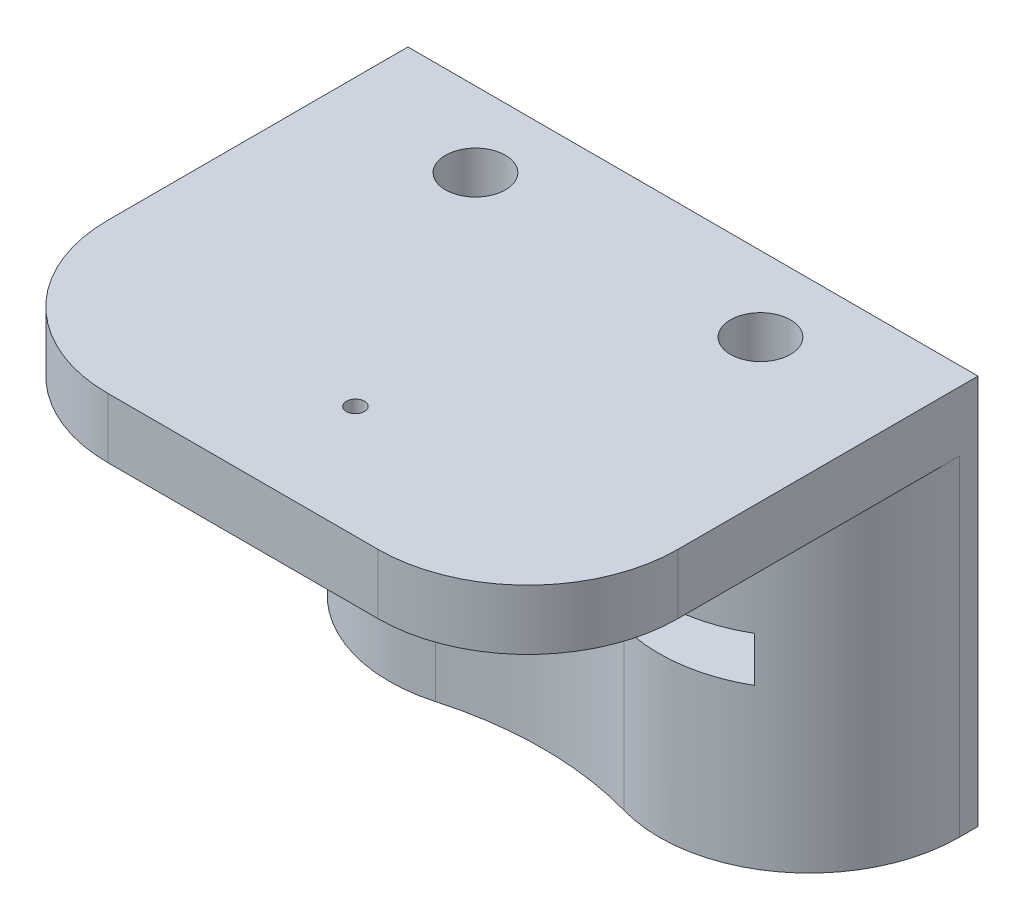
ISO-10303-21;
HEADER;
FILE_DESCRIPTION(('STEP AP214'),'2;1');
FILE_NAME('part.step','',(''),(''),'','','');
FILE_SCHEMA(('AUTOMOTIVE_DESIGN { 1 0 10303 214 1 1 1 1 }'));
ENDSEC;
DATA;
#1=APPLICATION_CONTEXT('core data for automotive mechanical design processes');
#2=APPLICATION_PROTOCOL_DEFINITION('international standard','automotive_design',2000,#1);
#3=PRODUCT_CONTEXT('',#1,'mechanical');
#4=PRODUCT('Part','Part','',(#3));
#5=PRODUCT_RELATED_PRODUCT_CATEGORY('part','',(#4));
#6=PRODUCT_DEFINITION_FORMATION('','',#4);
#7=PRODUCT_DEFINITION_CONTEXT('part definition',#1,'design');
#8=PRODUCT_DEFINITION('design','',#6,#7);
#9=PRODUCT_DEFINITION_SHAPE('','',#8);
#10=(LENGTH_UNIT() NAMED_UNIT(*) SI_UNIT(.MILLI.,.METRE.));
#11=(NAMED_UNIT(*) PLANE_ANGLE_UNIT() SI_UNIT($,.RADIAN.));
#12=(NAMED_UNIT(*) SI_UNIT($,.STERADIAN.) SOLID_ANGLE_UNIT());
#13=UNCERTAINTY_MEASURE_WITH_UNIT(LENGTH_MEASURE(1.E-05),#10,'distance_accuracy_value','');
#14=(GEOMETRIC_REPRESENTATION_CONTEXT(3) GLOBAL_UNCERTAINTY_ASSIGNED_CONTEXT((#13)) GLOBAL_UNIT_ASSIGNED_CONTEXT((#10,
#11,#12)) REPRESENTATION_CONTEXT('',''));
#15=CARTESIAN_POINT('',(0.,0.,0.));
#16=DIRECTION('',(0.,0.,1.));
#17=DIRECTION('',(1.,0.,0.));
#18=AXIS2_PLACEMENT_3D('',#15,#16,#17);
#19=CARTESIAN_POINT('',(-33.1070823408573,4.,37.625158927755));
#20=DIRECTION('',(0.,-1.,0.));
#21=DIRECTION('',(0.,0.,-1.));
#22=AXIS2_PLACEMENT_3D('',#19,#20,#21);
#23=PLANE('',#22);
#24=CARTESIAN_POINT('',(-14.6070823408573,4.,22.625158927755));
#25=DIRECTION('',(0.,1.,0.));
#26=DIRECTION('',(0.,0.,-1.));
#27=AXIS2_PLACEMENT_3D('',#24,#25,#26);
#28=CIRCLE('',#27,2.);
#29=CARTESIAN_POINT('',(-14.6070823408573,4.,24.625158927755));
#30=VERTEX_POINT('',#29);
#31=EDGE_CURVE('E239',#30,#30,#28,.T.);
#32=ORIENTED_EDGE('',*,*,#31,.F.);
#33=EDGE_LOOP('',(#32));
#34=FACE_BOUND('',#33,.T.);
#35=CARTESIAN_POINT('',(-33.6070823408573,4.,22.625158927755));
#36=DIRECTION('',(0.,1.,0.));
#37=DIRECTION('',(0.,0.,1.));
#38=AXIS2_PLACEMENT_3D('',#35,#36,#37);
#39=CIRCLE('',#38,2.);
#40=CARTESIAN_POINT('',(-33.6070823408573,4.,24.625158927755));
#41=VERTEX_POINT('',#40);
#42=EDGE_CURVE('E242',#41,#41,#39,.T.);
#43=ORIENTED_EDGE('',*,*,#42,.F.);
#44=EDGE_LOOP('',(#43));
#45=FACE_BOUND('',#44,.T.);
#46=DIRECTION('',(0.,0.,1.));
#47=VECTOR('',#46,1.);
#48=CARTESIAN_POINT('',(-43.1070823408573,4.,17.625158927755));
#49=LINE('',#48,#47);
#50=CARTESIAN_POINT('',(-43.1070823408573,4.,17.625158927755));
#51=VERTEX_POINT('',#50);
#52=CARTESIAN_POINT('',(-43.1070823408573,4.,37.625158927755));
#53=VERTEX_POINT('',#52);
#54=EDGE_CURVE('E265',#51,#53,#49,.T.);
#55=ORIENTED_EDGE('',*,*,#54,.T.);
#56=CARTESIAN_POINT('',(-33.1070823408573,4.,37.625158927755));
#57=DIRECTION('',(0.,1.,0.));
#58=DIRECTION('',(0.,0.,-1.));
#59=AXIS2_PLACEMENT_3D('',#56,#57,#58);
#60=CIRCLE('',#59,10.);
#61=CARTESIAN_POINT('',(-33.1070823408572,4.,47.625158927755));
#62=VERTEX_POINT('',#61);
#63=EDGE_CURVE('E268',#53,#62,#60,.T.);
#64=ORIENTED_EDGE('',*,*,#63,.T.);
#65=DIRECTION('',(1.,0.,0.));
#66=VECTOR('',#65,1.);
#67=CARTESIAN_POINT('',(-33.1070823408572,4.,47.625158927755));
#68=LINE('',#67,#66);
#69=CARTESIAN_POINT('',(-15.1070823408574,4.,47.625158927755));
#70=VERTEX_POINT('',#69);
#71=EDGE_CURVE('E271',#62,#70,#68,.T.);
#72=ORIENTED_EDGE('',*,*,#71,.T.);
#73=CARTESIAN_POINT('',(-15.1070823408573,4.,37.625158927755));
#74=DIRECTION('',(0.,1.,0.));
#75=DIRECTION('',(0.,0.,1.));
#76=AXIS2_PLACEMENT_3D('',#73,#74,#75);
#77=CIRCLE('',#76,10.);
#78=CARTESIAN_POINT('',(-5.10708234085731,4.,37.625158927755));
#79=VERTEX_POINT('',#78);
#80=EDGE_CURVE('E273',#70,#79,#77,.T.);
#81=ORIENTED_EDGE('',*,*,#80,.T.);
#82=DIRECTION('',(0.,0.,-1.));
#83=VECTOR('',#82,1.);
#84=CARTESIAN_POINT('',(-5.10708234085731,4.,17.625158927755));
#85=LINE('',#84,#83);
#86=CARTESIAN_POINT('',(-5.10708234085731,4.,17.625158927755));
#87=VERTEX_POINT('',#86);
#88=EDGE_CURVE('E275',#79,#87,#85,.T.);
#89=ORIENTED_EDGE('',*,*,#88,.T.);
#90=DIRECTION('',(-1.,0.,0.));
#91=VECTOR('',#90,1.);
#92=CARTESIAN_POINT('',(-43.1070823408573,4.,17.625158927755));
#93=LINE('',#92,#91);
#94=EDGE_CURVE('E277',#87,#51,#93,.T.);
#95=ORIENTED_EDGE('',*,*,#94,.T.);
#96=EDGE_LOOP('',(#55,#64,#72,#81,#89,#95));
#97=FACE_BOUND('',#96,.T.);
#98=CARTESIAN_POINT('',(-24.1070823408573,4.,40.125158927755));
#99=DIRECTION('',(0.,1.,0.));
#100=DIRECTION('',(0.,0.,1.));
#101=AXIS2_PLACEMENT_3D('',#98,#99,#100);
#102=CIRCLE('',#101,0.600000000000001);
#103=CARTESIAN_POINT('',(-24.1070823408573,4.,40.725158927755));
#104=VERTEX_POINT('',#103);
#105=EDGE_CURVE('E259',#104,#104,#102,.T.);
#106=ORIENTED_EDGE('',*,*,#105,.F.);
#107=EDGE_LOOP('',(#106));
#108=FACE_BOUND('',#107,.T.);
#109=ADVANCED_FACE('F33',(#34,#45,#97,#108),#23,.F.);
#110=CARTESIAN_POINT('',(-33.1070823408573,0.,37.625158927755));
#111=DIRECTION('',(0.,-1.,0.));
#112=DIRECTION('',(0.,0.,-1.));
#113=AXIS2_PLACEMENT_3D('',#110,#111,#112);
#114=PLANE('',#113);
#115=CARTESIAN_POINT('',(-24.1070823408573,0.,50.675158927755));
#116=DIRECTION('',(0.,1.,0.));
#117=DIRECTION('',(0.,0.,-1.));
#118=AXIS2_PLACEMENT_3D('',#115,#116,#117);
#119=CIRCLE('',#118,23.05);
#120=CARTESIAN_POINT('',(-17.8302290882098,0.,28.4962587466205));
#121=VERTEX_POINT('',#120);
#122=CARTESIAN_POINT('',(-30.3839355935048,0.,28.4962587466205));
#123=VERTEX_POINT('',#122);
#124=EDGE_CURVE('E245',#121,#123,#119,.T.);
#125=ORIENTED_EDGE('',*,*,#124,.F.);
#126=CARTESIAN_POINT('',(-15.1070823408573,0.,18.8741762385361));
#127=DIRECTION('',(0.,-1.,0.));
#128=DIRECTION('',(0.,0.,-1.));
#129=AXIS2_PLACEMENT_3D('',#126,#127,#128);
#130=CIRCLE('',#129,10.);
#131=CARTESIAN_POINT('',(-5.10708234085731,0.,18.8741762385361));
#132=VERTEX_POINT('',#131);
#133=EDGE_CURVE('E326',#121,#132,#130,.F.);
#134=ORIENTED_EDGE('',*,*,#133,.T.);
#135=DIRECTION('',(0.,0.,-1.));
#136=VECTOR('',#135,1.);
#137=CARTESIAN_POINT('',(-5.10708234085731,0.,37.625158927755));
#138=LINE('',#137,#136);
#139=CARTESIAN_POINT('',(-5.10708234085731,0.,37.625158927755));
#140=VERTEX_POINT('',#139);
#141=EDGE_CURVE('E321',#140,#132,#138,.T.);
#142=ORIENTED_EDGE('',*,*,#141,.F.);
#143=CARTESIAN_POINT('',(-15.1070823408573,0.,37.625158927755));
#144=DIRECTION('',(0.,1.,0.));
#145=DIRECTION('',(0.,0.,1.));
#146=AXIS2_PLACEMENT_3D('',#143,#144,#145);
#147=CIRCLE('',#146,10.);
#148=CARTESIAN_POINT('',(-15.1070823408574,0.,47.625158927755));
#149=VERTEX_POINT('',#148);
#150=EDGE_CURVE('E269',#149,#140,#147,.T.);
#151=ORIENTED_EDGE('',*,*,#150,.F.);
#152=DIRECTION('',(1.,0.,0.));
#153=VECTOR('',#152,1.);
#154=CARTESIAN_POINT('',(-33.1070823408572,0.,47.625158927755));
#155=LINE('',#154,#153);
#156=CARTESIAN_POINT('',(-33.1070823408572,0.,47.625158927755));
#157=VERTEX_POINT('',#156);
#158=EDGE_CURVE('E281',#157,#149,#155,.T.);
#159=ORIENTED_EDGE('',*,*,#158,.F.);
#160=CARTESIAN_POINT('',(-33.1070823408573,0.,37.625158927755));
#161=DIRECTION('',(0.,1.,0.));
#162=DIRECTION('',(0.,0.,-1.));
#163=AXIS2_PLACEMENT_3D('',#160,#161,#162);
#164=CIRCLE('',#163,10.);
#165=CARTESIAN_POINT('',(-43.1070823408573,0.,37.625158927755));
#166=VERTEX_POINT('',#165);
#167=EDGE_CURVE('E262',#166,#157,#164,.T.);
#168=ORIENTED_EDGE('',*,*,#167,.F.);
#169=DIRECTION('',(0.,0.,1.));
#170=VECTOR('',#169,1.);
#171=CARTESIAN_POINT('',(-43.1070823408573,0.,37.625158927755));
#172=LINE('',#171,#170);
#173=CARTESIAN_POINT('',(-43.1070823408573,0.,18.8741762385361));
#174=VERTEX_POINT('',#173);
#175=EDGE_CURVE('E301',#174,#166,#172,.T.);
#176=ORIENTED_EDGE('',*,*,#175,.F.);
#177=CARTESIAN_POINT('',(-33.1070823408573,0.,18.8741762385361));
#178=DIRECTION('',(0.,-1.,0.));
#179=DIRECTION('',(0.,0.,-1.));
#180=AXIS2_PLACEMENT_3D('',#177,#178,#179);
#181=CIRCLE('',#180,10.);
#182=EDGE_CURVE('E312',#174,#123,#181,.F.);
#183=ORIENTED_EDGE('',*,*,#182,.T.);
#184=EDGE_LOOP('',(#125,#134,#142,#151,#159,#168,#176,#183));
#185=FACE_BOUND('',#184,.T.);
#186=CARTESIAN_POINT('',(-24.1070823408573,0.,40.125158927755));
#187=DIRECTION('',(0.,1.,0.));
#188=DIRECTION('',(0.,0.,1.));
#189=AXIS2_PLACEMENT_3D('',#186,#187,#188);
#190=CIRCLE('',#189,0.600000000000001);
#191=CARTESIAN_POINT('',(-24.1070823408573,0.,40.725158927755));
#192=VERTEX_POINT('',#191);
#193=EDGE_CURVE('E257',#192,#192,#190,.T.);
#194=ORIENTED_EDGE('',*,*,#193,.T.);
#195=EDGE_LOOP('',(#194));
#196=FACE_BOUND('',#195,.T.);
#197=ADVANCED_FACE('F365',(#185,#196),#114,.T.);
#198=CARTESIAN_POINT('',(-43.1070823408573,4.,17.625158927755));
#199=DIRECTION('',(1.,0.,0.));
#200=DIRECTION('',(0.,0.,-1.));
#201=AXIS2_PLACEMENT_3D('',#198,#199,#200);
#202=PLANE('',#201);
#203=DIRECTION('',(0.,0.,-1.));
#204=VECTOR('',#203,1.);
#205=CARTESIAN_POINT('',(-43.1070823408573,-22.,17.625158927755));
#206=LINE('',#205,#204);
#207=CARTESIAN_POINT('',(-43.1070823408573,-22.,18.8741762385361));
#208=VERTEX_POINT('',#207);
#209=CARTESIAN_POINT('',(-43.1070823408573,-22.,17.625158927755));
#210=VERTEX_POINT('',#209);
#211=EDGE_CURVE('E246',#208,#210,#206,.T.);
#212=ORIENTED_EDGE('',*,*,#211,.F.);
#213=DIRECTION('',(0.,1.,0.));
#214=VECTOR('',#213,1.);
#215=CARTESIAN_POINT('',(-43.1070823408573,4.,18.8741762385361));
#216=LINE('',#215,#214);
#217=EDGE_CURVE('E303',#208,#174,#216,.T.);
#218=ORIENTED_EDGE('',*,*,#217,.T.);
#219=ORIENTED_EDGE('',*,*,#175,.T.);
#220=DIRECTION('',(0.,-1.,0.));
#221=VECTOR('',#220,1.);
#222=CARTESIAN_POINT('',(-43.1070823408573,4.,37.625158927755));
#223=LINE('',#222,#221);
#224=EDGE_CURVE('E298',#53,#166,#223,.T.);
#225=ORIENTED_EDGE('',*,*,#224,.F.);
#226=ORIENTED_EDGE('',*,*,#54,.F.);
#227=DIRECTION('',(0.,-1.,0.));
#228=VECTOR('',#227,1.);
#229=CARTESIAN_POINT('',(-43.1070823408573,4.,17.625158927755));
#230=LINE('',#229,#228);
#231=EDGE_CURVE('E279',#51,#210,#230,.T.);
#232=ORIENTED_EDGE('',*,*,#231,.T.);
#233=EDGE_LOOP('',(#212,#218,#219,#225,#226,#232));
#234=FACE_BOUND('',#233,.T.);
#235=ADVANCED_FACE('F396',(#234),#202,.F.);
#236=CARTESIAN_POINT('',(-33.1070823408573,4.,37.625158927755));
#237=DIRECTION('',(0.,-1.,0.));
#238=DIRECTION('',(0.,0.,-1.));
#239=AXIS2_PLACEMENT_3D('',#236,#237,#238);
#240=CYLINDRICAL_SURFACE('',#239,10.);
#241=ORIENTED_EDGE('',*,*,#167,.T.);
#242=DIRECTION('',(0.,-1.,0.));
#243=VECTOR('',#242,1.);
#244=CARTESIAN_POINT('',(-33.1070823408572,4.,47.625158927755));
#245=LINE('',#244,#243);
#246=EDGE_CURVE('E295',#62,#157,#245,.T.);
#247=ORIENTED_EDGE('',*,*,#246,.F.);
#248=ORIENTED_EDGE('',*,*,#63,.F.);
#249=ORIENTED_EDGE('',*,*,#224,.T.);
#250=EDGE_LOOP('',(#241,#247,#248,#249));
#251=FACE_BOUND('',#250,.T.);
#252=ADVANCED_FACE('F411',(#251),#240,.T.);
#253=CARTESIAN_POINT('',(-33.1070823408572,4.,47.625158927755));
#254=DIRECTION('',(0.,0.,-1.));
#255=DIRECTION('',(-1.,0.,0.));
#256=AXIS2_PLACEMENT_3D('',#253,#254,#255);
#257=PLANE('',#256);
#258=ORIENTED_EDGE('',*,*,#158,.T.);
#259=DIRECTION('',(0.,-1.,0.));
#260=VECTOR('',#259,1.);
#261=CARTESIAN_POINT('',(-15.1070823408574,4.,47.625158927755));
#262=LINE('',#261,#260);
#263=EDGE_CURVE('E292',#70,#149,#262,.T.);
#264=ORIENTED_EDGE('',*,*,#263,.F.);
#265=ORIENTED_EDGE('',*,*,#71,.F.);
#266=ORIENTED_EDGE('',*,*,#246,.T.);
#267=EDGE_LOOP('',(#258,#264,#265,#266));
#268=FACE_BOUND('',#267,.T.);
#269=ADVANCED_FACE('F408',(#268),#257,.F.);
#270=CARTESIAN_POINT('',(-15.1070823408573,4.,37.625158927755));
#271=DIRECTION('',(0.,-1.,0.));
#272=DIRECTION('',(0.,0.,-1.));
#273=AXIS2_PLACEMENT_3D('',#270,#271,#272);
#274=CYLINDRICAL_SURFACE('',#273,10.);
#275=ORIENTED_EDGE('',*,*,#150,.T.);
#276=DIRECTION('',(0.,-1.,0.));
#277=VECTOR('',#276,1.);
#278=CARTESIAN_POINT('',(-5.10708234085731,4.,37.625158927755));
#279=LINE('',#278,#277);
#280=EDGE_CURVE('E289',#79,#140,#279,.T.);
#281=ORIENTED_EDGE('',*,*,#280,.F.);
#282=ORIENTED_EDGE('',*,*,#80,.F.);
#283=ORIENTED_EDGE('',*,*,#263,.T.);
#284=EDGE_LOOP('',(#275,#281,#282,#283));
#285=FACE_BOUND('',#284,.T.);
#286=ADVANCED_FACE('F406',(#285),#274,.T.);
#287=CARTESIAN_POINT('',(-5.10708234085731,4.,17.625158927755));
#288=DIRECTION('',(-1.,0.,0.));
#289=DIRECTION('',(0.,0.,1.));
#290=AXIS2_PLACEMENT_3D('',#287,#288,#289);
#291=PLANE('',#290);
#292=ORIENTED_EDGE('',*,*,#280,.T.);
#293=ORIENTED_EDGE('',*,*,#141,.T.);
#294=DIRECTION('',(0.,1.,0.));
#295=VECTOR('',#294,1.);
#296=CARTESIAN_POINT('',(-5.10708234085731,4.,18.8741762385361));
#297=LINE('',#296,#295);
#298=CARTESIAN_POINT('',(-5.10708234085731,-22.,18.8741762385361));
#299=VERTEX_POINT('',#298);
#300=EDGE_CURVE('E319',#132,#299,#297,.F.);
#301=ORIENTED_EDGE('',*,*,#300,.T.);
#302=DIRECTION('',(0.,0.,1.));
#303=VECTOR('',#302,1.);
#304=CARTESIAN_POINT('',(-5.10708234085731,-22.,17.625158927755));
#305=LINE('',#304,#303);
#306=CARTESIAN_POINT('',(-5.10708234085731,-22.,17.625158927755));
#307=VERTEX_POINT('',#306);
#308=EDGE_CURVE('E251',#307,#299,#305,.T.);
#309=ORIENTED_EDGE('',*,*,#308,.F.);
#310=DIRECTION('',(0.,-1.,0.));
#311=VECTOR('',#310,1.);
#312=CARTESIAN_POINT('',(-5.10708234085731,4.,17.625158927755));
#313=LINE('',#312,#311);
#314=EDGE_CURVE('E287',#87,#307,#313,.T.);
#315=ORIENTED_EDGE('',*,*,#314,.F.);
#316=ORIENTED_EDGE('',*,*,#88,.F.);
#317=EDGE_LOOP('',(#292,#293,#301,#309,#315,#316));
#318=FACE_BOUND('',#317,.T.);
#319=ADVANCED_FACE('F359',(#318),#291,.F.);
#320=CARTESIAN_POINT('',(-43.1070823408573,4.,17.625158927755));
#321=DIRECTION('',(0.,0.,1.));
#322=DIRECTION('',(1.,0.,0.));
#323=AXIS2_PLACEMENT_3D('',#320,#321,#322);
#324=PLANE('',#323);
#325=DIRECTION('',(0.,-1.,0.));
#326=VECTOR('',#325,1.);
#327=CARTESIAN_POINT('',(-10.1070823408573,-8.4,17.625158927755));
#328=LINE('',#327,#326);
#329=CARTESIAN_POINT('',(-10.1070823408573,-8.4,17.625158927755));
#330=VERTEX_POINT('',#329);
#331=CARTESIAN_POINT('',(-10.1070823408573,-11.4,17.625158927755));
#332=VERTEX_POINT('',#331);
#333=EDGE_CURVE('E182',#330,#332,#328,.T.);
#334=ORIENTED_EDGE('',*,*,#333,.F.);
#335=DIRECTION('',(1.,0.,0.));
#336=VECTOR('',#335,1.);
#337=CARTESIAN_POINT('',(-19.1070823408573,-8.4,17.625158927755));
#338=LINE('',#337,#336);
#339=CARTESIAN_POINT('',(-19.1070823408573,-8.4,17.625158927755));
#340=VERTEX_POINT('',#339);
#341=EDGE_CURVE('E48',#340,#330,#338,.T.);
#342=ORIENTED_EDGE('',*,*,#341,.F.);
#343=DIRECTION('',(0.,1.,0.));
#344=VECTOR('',#343,1.);
#345=CARTESIAN_POINT('',(-19.1070823408573,-8.4,17.625158927755));
#346=LINE('',#345,#344);
#347=CARTESIAN_POINT('',(-19.1070823408573,-11.4,17.625158927755));
#348=VERTEX_POINT('',#347);
#349=EDGE_CURVE('E189',#348,#340,#346,.T.);
#350=ORIENTED_EDGE('',*,*,#349,.F.);
#351=DIRECTION('',(-1.,0.,0.));
#352=VECTOR('',#351,1.);
#353=CARTESIAN_POINT('',(-10.1070823408573,-11.4,17.625158927755));
#354=LINE('',#353,#352);
#355=EDGE_CURVE('E173',#332,#348,#354,.T.);
#356=ORIENTED_EDGE('',*,*,#355,.F.);
#357=EDGE_LOOP('',(#334,#342,#350,#356));
#358=FACE_BOUND('',#357,.T.);
#359=DIRECTION('',(-1.,0.,0.));
#360=VECTOR('',#359,1.);
#361=CARTESIAN_POINT('',(-38.1070823408573,-11.4,17.625158927755));
#362=LINE('',#361,#360);
#363=CARTESIAN_POINT('',(-29.1070823408573,-11.4,17.625158927755));
#364=VERTEX_POINT('',#363);
#365=CARTESIAN_POINT('',(-38.1070823408573,-11.4,17.625158927755));
#366=VERTEX_POINT('',#365);
#367=EDGE_CURVE('E210',#364,#366,#362,.T.);
#368=ORIENTED_EDGE('',*,*,#367,.F.);
#369=DIRECTION('',(0.,-1.,0.));
#370=VECTOR('',#369,1.);
#371=CARTESIAN_POINT('',(-29.1070823408573,-8.4,17.625158927755));
#372=LINE('',#371,#370);
#373=CARTESIAN_POINT('',(-29.1070823408573,-8.4,17.625158927755));
#374=VERTEX_POINT('',#373);
#375=EDGE_CURVE('E208',#374,#364,#372,.T.);
#376=ORIENTED_EDGE('',*,*,#375,.F.);
#377=DIRECTION('',(1.,0.,0.));
#378=VECTOR('',#377,1.);
#379=CARTESIAN_POINT('',(-29.1070823408573,-8.4,17.625158927755));
#380=LINE('',#379,#378);
#381=CARTESIAN_POINT('',(-38.1070823408573,-8.4,17.625158927755));
#382=VERTEX_POINT('',#381);
#383=EDGE_CURVE('E216',#382,#374,#380,.T.);
#384=ORIENTED_EDGE('',*,*,#383,.F.);
#385=DIRECTION('',(0.,1.,0.));
#386=VECTOR('',#385,1.);
#387=CARTESIAN_POINT('',(-38.1070823408573,-8.4,17.625158927755));
#388=LINE('',#387,#386);
#389=EDGE_CURVE('E213',#366,#382,#388,.T.);
#390=ORIENTED_EDGE('',*,*,#389,.F.);
#391=EDGE_LOOP('',(#368,#376,#384,#390));
#392=FACE_BOUND('',#391,.T.);
#393=ORIENTED_EDGE('',*,*,#314,.T.);
#394=DIRECTION('',(1.,0.,0.));
#395=VECTOR('',#394,1.);
#396=CARTESIAN_POINT('',(-43.1070823408573,-22.,17.625158927755));
#397=LINE('',#396,#395);
#398=EDGE_CURVE('E248',#210,#307,#397,.T.);
#399=ORIENTED_EDGE('',*,*,#398,.F.);
#400=ORIENTED_EDGE('',*,*,#231,.F.);
#401=ORIENTED_EDGE('',*,*,#94,.F.);
#402=EDGE_LOOP('',(#393,#399,#400,#401));
#403=FACE_BOUND('',#402,.T.);
#404=ADVANCED_FACE('F186',(#358,#392,#403),#324,.F.);
#405=CARTESIAN_POINT('',(-24.1070823408573,4.,40.125158927755));
#406=DIRECTION('',(0.,-1.,0.));
#407=DIRECTION('',(0.,0.,-1.));
#408=AXIS2_PLACEMENT_3D('',#405,#406,#407);
#409=CYLINDRICAL_SURFACE('',#408,0.600000000000001);
#410=ORIENTED_EDGE('',*,*,#105,.T.);
#411=EDGE_LOOP('',(#410));
#412=FACE_BOUND('',#411,.T.);
#413=ORIENTED_EDGE('',*,*,#193,.F.);
#414=EDGE_LOOP('',(#413));
#415=FACE_BOUND('',#414,.T.);
#416=ADVANCED_FACE('F430',(#412,#415),#409,.F.);
#417=CARTESIAN_POINT('',(-24.1070823408573,-22.,50.675158927755));
#418=DIRECTION('',(0.,1.,0.));
#419=DIRECTION('',(0.,0.,1.));
#420=AXIS2_PLACEMENT_3D('',#417,#418,#419);
#421=CYLINDRICAL_SURFACE('',#420,23.05);
#422=DIRECTION('',(0.,1.,0.));
#423=VECTOR('',#422,1.);
#424=CARTESIAN_POINT('',(-19.1070823408573,-22.,28.1739922913337));
#425=LINE('',#424,#423);
#426=CARTESIAN_POINT('',(-19.1070823408573,-11.4,28.1739922913337));
#427=VERTEX_POINT('',#426);
#428=CARTESIAN_POINT('',(-19.1070823408573,-8.4,28.1739922913337));
#429=VERTEX_POINT('',#428);
#430=EDGE_CURVE('E11',#427,#429,#425,.T.);
#431=ORIENTED_EDGE('',*,*,#430,.T.);
#432=CARTESIAN_POINT('',(-24.1070823408573,-8.4,50.675158927755));
#433=DIRECTION('',(0.,1.,0.));
#434=DIRECTION('',(-1.,0.,0.));
#435=AXIS2_PLACEMENT_3D('',#432,#433,#434);
#436=CIRCLE('',#435,23.05);
#437=CARTESIAN_POINT('',(-17.8302290882098,-8.4,28.4962587466205));
#438=VERTEX_POINT('',#437);
#439=EDGE_CURVE('E205',#429,#438,#436,.F.);
#440=ORIENTED_EDGE('',*,*,#439,.T.);
#441=DIRECTION('',(0.,1.,0.));
#442=VECTOR('',#441,1.);
#443=CARTESIAN_POINT('',(-17.8302290882098,-22.,28.4962587466205));
#444=LINE('',#443,#442);
#445=EDGE_CURVE('E315',#438,#121,#444,.T.);
#446=ORIENTED_EDGE('',*,*,#445,.T.);
#447=ORIENTED_EDGE('',*,*,#124,.T.);
#448=DIRECTION('',(0.,1.,0.));
#449=VECTOR('',#448,1.);
#450=CARTESIAN_POINT('',(-30.3839355935048,-22.,28.4962587466205));
#451=LINE('',#450,#449);
#452=CARTESIAN_POINT('',(-30.3839355935048,-8.4,28.4962587466205));
#453=VERTEX_POINT('',#452);
#454=EDGE_CURVE('E307',#123,#453,#451,.F.);
#455=ORIENTED_EDGE('',*,*,#454,.T.);
#456=CARTESIAN_POINT('',(-24.1070823408573,-8.4,50.675158927755));
#457=DIRECTION('',(0.,1.,0.));
#458=DIRECTION('',(0.,0.,1.));
#459=AXIS2_PLACEMENT_3D('',#456,#457,#458);
#460=CIRCLE('',#459,23.05);
#461=CARTESIAN_POINT('',(-29.1070823408573,-8.4,28.1739922913337));
#462=VERTEX_POINT('',#461);
#463=EDGE_CURVE('E236',#453,#462,#460,.F.);
#464=ORIENTED_EDGE('',*,*,#463,.T.);
#465=DIRECTION('',(0.,1.,0.));
#466=VECTOR('',#465,1.);
#467=CARTESIAN_POINT('',(-29.1070823408573,-22.,28.1739922913337));
#468=LINE('',#467,#466);
#469=CARTESIAN_POINT('',(-29.1070823408573,-11.4,28.1739922913337));
#470=VERTEX_POINT('',#469);
#471=EDGE_CURVE('E333',#462,#470,#468,.F.);
#472=ORIENTED_EDGE('',*,*,#471,.T.);
#473=CARTESIAN_POINT('',(-24.1070823408573,-11.4,50.675158927755));
#474=DIRECTION('',(0.,-1.,0.));
#475=DIRECTION('',(0.,0.,-1.));
#476=AXIS2_PLACEMENT_3D('',#473,#474,#475);
#477=CIRCLE('',#476,23.05);
#478=CARTESIAN_POINT('',(-30.3839355935048,-11.4,28.4962587466205));
#479=VERTEX_POINT('',#478);
#480=EDGE_CURVE('E230',#470,#479,#477,.F.);
#481=ORIENTED_EDGE('',*,*,#480,.T.);
#482=CARTESIAN_POINT('',(-30.3839355935048,-22.,28.4962587466205));
#483=VERTEX_POINT('',#482);
#484=EDGE_CURVE('E306',#479,#483,#451,.F.);
#485=ORIENTED_EDGE('',*,*,#484,.T.);
#486=CARTESIAN_POINT('',(-24.1070823408573,-22.,50.675158927755));
#487=DIRECTION('',(0.,1.,0.));
#488=DIRECTION('',(0.,0.,-1.));
#489=AXIS2_PLACEMENT_3D('',#486,#487,#488);
#490=CIRCLE('',#489,23.05);
#491=CARTESIAN_POINT('',(-17.8302290882098,-22.,28.4962587466205));
#492=VERTEX_POINT('',#491);
#493=EDGE_CURVE('E254',#492,#483,#490,.T.);
#494=ORIENTED_EDGE('',*,*,#493,.F.);
#495=CARTESIAN_POINT('',(-17.8302290882098,-11.4,28.4962587466205));
#496=VERTEX_POINT('',#495);
#497=EDGE_CURVE('E316',#492,#496,#444,.T.);
#498=ORIENTED_EDGE('',*,*,#497,.T.);
#499=CARTESIAN_POINT('',(-24.1070823408573,-11.4,50.675158927755));
#500=DIRECTION('',(0.,-1.,0.));
#501=DIRECTION('',(1.,0.,0.));
#502=AXIS2_PLACEMENT_3D('',#499,#500,#501);
#503=CIRCLE('',#502,23.05);
#504=EDGE_CURVE('E199',#496,#427,#503,.F.);
#505=ORIENTED_EDGE('',*,*,#504,.T.);
#506=EDGE_LOOP('',(#431,#440,#446,#447,#455,#464,#472,#481,#485,#494,#498,#505));
#507=FACE_BOUND('',#506,.T.);
#508=ADVANCED_FACE('F345',(#507),#421,.F.);
#509=CARTESIAN_POINT('',(-24.1070823408573,-22.,50.675158927755));
#510=DIRECTION('',(0.,-1.,0.));
#511=DIRECTION('',(0.,0.,-1.));
#512=AXIS2_PLACEMENT_3D('',#509,#510,#511);
#513=PLANE('',#512);
#514=ORIENTED_EDGE('',*,*,#308,.T.);
#515=CARTESIAN_POINT('',(-15.1070823408573,-22.,18.8741762385361));
#516=DIRECTION('',(0.,-1.,0.));
#517=DIRECTION('',(0.,0.,-1.));
#518=AXIS2_PLACEMENT_3D('',#515,#516,#517);
#519=CIRCLE('',#518,10.);
#520=EDGE_CURVE('E324',#299,#492,#519,.T.);
#521=ORIENTED_EDGE('',*,*,#520,.T.);
#522=ORIENTED_EDGE('',*,*,#493,.T.);
#523=CARTESIAN_POINT('',(-33.1070823408573,-22.,18.8741762385361));
#524=DIRECTION('',(0.,-1.,0.));
#525=DIRECTION('',(0.,0.,-1.));
#526=AXIS2_PLACEMENT_3D('',#523,#524,#525);
#527=CIRCLE('',#526,10.);
#528=EDGE_CURVE('E310',#483,#208,#527,.T.);
#529=ORIENTED_EDGE('',*,*,#528,.T.);
#530=ORIENTED_EDGE('',*,*,#211,.T.);
#531=ORIENTED_EDGE('',*,*,#398,.T.);
#532=EDGE_LOOP('',(#514,#521,#522,#529,#530,#531));
#533=FACE_BOUND('',#532,.T.);
#534=ADVANCED_FACE('F353',(#533),#513,.T.);
#535=CARTESIAN_POINT('',(-33.1070823408573,-22.,18.8741762385361));
#536=DIRECTION('',(0.,1.,0.));
#537=DIRECTION('',(0.,0.,1.));
#538=AXIS2_PLACEMENT_3D('',#535,#536,#537);
#539=CYLINDRICAL_SURFACE('',#538,10.);
#540=CARTESIAN_POINT('',(-33.1070823408573,-8.4,18.8741762385361));
#541=DIRECTION('',(0.,1.,0.));
#542=DIRECTION('',(0.,0.,1.));
#543=AXIS2_PLACEMENT_3D('',#540,#541,#542);
#544=CIRCLE('',#543,10.);
#545=CARTESIAN_POINT('',(-38.1070823408573,-8.4,27.5344302763805));
#546=VERTEX_POINT('',#545);
#547=EDGE_CURVE('E234',#453,#546,#544,.F.);
#548=ORIENTED_EDGE('',*,*,#547,.F.);
#549=ORIENTED_EDGE('',*,*,#454,.F.);
#550=ORIENTED_EDGE('',*,*,#182,.F.);
#551=ORIENTED_EDGE('',*,*,#217,.F.);
#552=ORIENTED_EDGE('',*,*,#528,.F.);
#553=ORIENTED_EDGE('',*,*,#484,.F.);
#554=CARTESIAN_POINT('',(-33.1070823408573,-11.4,18.8741762385361));
#555=DIRECTION('',(0.,-1.,0.));
#556=DIRECTION('',(0.,0.,-1.));
#557=AXIS2_PLACEMENT_3D('',#554,#555,#556);
#558=CIRCLE('',#557,10.);
#559=CARTESIAN_POINT('',(-38.1070823408573,-11.4,27.5344302763805));
#560=VERTEX_POINT('',#559);
#561=EDGE_CURVE('E222',#560,#479,#558,.F.);
#562=ORIENTED_EDGE('',*,*,#561,.F.);
#563=DIRECTION('',(0.,1.,0.));
#564=VECTOR('',#563,1.);
#565=CARTESIAN_POINT('',(-38.1070823408573,-22.,27.5344302763805));
#566=LINE('',#565,#564);
#567=EDGE_CURVE('E328',#546,#560,#566,.F.);
#568=ORIENTED_EDGE('',*,*,#567,.F.);
#569=EDGE_LOOP('',(#548,#549,#550,#551,#552,#553,#562,#568));
#570=FACE_BOUND('',#569,.T.);
#571=ADVANCED_FACE('F374',(#570),#539,.T.);
#572=CARTESIAN_POINT('',(-15.1070823408573,-22.,18.8741762385361));
#573=DIRECTION('',(0.,1.,0.));
#574=DIRECTION('',(0.,0.,1.));
#575=AXIS2_PLACEMENT_3D('',#572,#573,#574);
#576=CYLINDRICAL_SURFACE('',#575,10.);
#577=CARTESIAN_POINT('',(-15.1070823408573,-8.4,18.8741762385361));
#578=DIRECTION('',(0.,1.,0.));
#579=DIRECTION('',(-1.,0.,0.));
#580=AXIS2_PLACEMENT_3D('',#577,#578,#579);
#581=CIRCLE('',#580,10.);
#582=CARTESIAN_POINT('',(-10.1070823408573,-8.4,27.5344302763805));
#583=VERTEX_POINT('',#582);
#584=EDGE_CURVE('E203',#583,#438,#581,.F.);
#585=ORIENTED_EDGE('',*,*,#584,.F.);
#586=DIRECTION('',(0.,1.,0.));
#587=VECTOR('',#586,1.);
#588=CARTESIAN_POINT('',(-10.1070823408573,-22.,27.5344302763805));
#589=LINE('',#588,#587);
#590=CARTESIAN_POINT('',(-10.1070823408573,-11.4,27.5344302763805));
#591=VERTEX_POINT('',#590);
#592=EDGE_CURVE('E41',#591,#583,#589,.T.);
#593=ORIENTED_EDGE('',*,*,#592,.F.);
#594=CARTESIAN_POINT('',(-15.1070823408573,-11.4,18.8741762385361));
#595=DIRECTION('',(0.,-1.,0.));
#596=DIRECTION('',(1.,0.,0.));
#597=AXIS2_PLACEMENT_3D('',#594,#595,#596);
#598=CIRCLE('',#597,10.);
#599=EDGE_CURVE('E176',#496,#591,#598,.F.);
#600=ORIENTED_EDGE('',*,*,#599,.F.);
#601=ORIENTED_EDGE('',*,*,#497,.F.);
#602=ORIENTED_EDGE('',*,*,#520,.F.);
#603=ORIENTED_EDGE('',*,*,#300,.F.);
#604=ORIENTED_EDGE('',*,*,#133,.F.);
#605=ORIENTED_EDGE('',*,*,#445,.F.);
#606=EDGE_LOOP('',(#585,#593,#600,#601,#602,#603,#604,#605));
#607=FACE_BOUND('',#606,.T.);
#608=ADVANCED_FACE('F35',(#607),#576,.T.);
#609=CARTESIAN_POINT('',(-33.6070823408573,-11.4,22.625158927755));
#610=DIRECTION('',(0.,1.,0.));
#611=DIRECTION('',(0.,0.,1.));
#612=AXIS2_PLACEMENT_3D('',#609,#610,#611);
#613=CYLINDRICAL_SURFACE('',#612,2.);
#614=CARTESIAN_POINT('',(-33.6070823408573,-8.4,22.625158927755));
#615=DIRECTION('',(0.,1.,0.));
#616=DIRECTION('',(0.,0.,1.));
#617=AXIS2_PLACEMENT_3D('',#614,#615,#616);
#618=CIRCLE('',#617,2.);
#619=CARTESIAN_POINT('',(-33.6070823408573,-8.4,24.625158927755));
#620=VERTEX_POINT('',#619);
#621=EDGE_CURVE('E233',#620,#620,#618,.F.);
#622=CARTESIAN_POINT('',(-33.6070823408573,-8.4,24.625158927755));
#623=CARTESIAN_POINT('',(-33.6070823408573,-8.27083333333334,24.625158927755));
#624=CARTESIAN_POINT('',(-33.6070823408573,-8.14166666666667,24.625158927755));
#625=CARTESIAN_POINT('',(-33.6070823408573,-7.88333333333334,24.625158927755));
#626=CARTESIAN_POINT('',(-33.6070823408573,-7.75416666666667,24.625158927755));
#627=CARTESIAN_POINT('',(-33.6070823408573,-7.49583333333334,24.625158927755));
#628=CARTESIAN_POINT('',(-33.6070823408573,-7.36666666666667,24.625158927755));
#629=CARTESIAN_POINT('',(-33.6070823408573,-7.10833333333334,24.625158927755));
#630=CARTESIAN_POINT('',(-33.6070823408573,-6.97916666666667,24.625158927755));
#631=CARTESIAN_POINT('',(-33.6070823408573,-6.72083333333334,24.625158927755));
#632=CARTESIAN_POINT('',(-33.6070823408573,-6.59166666666667,24.625158927755));
#633=CARTESIAN_POINT('',(-33.6070823408573,-6.33333333333334,24.625158927755));
#634=CARTESIAN_POINT('',(-33.6070823408573,-6.20416666666667,24.625158927755));
#635=CARTESIAN_POINT('',(-33.6070823408573,-5.94583333333334,24.625158927755));
#636=CARTESIAN_POINT('',(-33.6070823408573,-5.81666666666667,24.625158927755));
#637=CARTESIAN_POINT('',(-33.6070823408573,-5.55833333333334,24.625158927755));
#638=CARTESIAN_POINT('',(-33.6070823408573,-5.42916666666667,24.625158927755));
#639=CARTESIAN_POINT('',(-33.6070823408573,-5.17083333333334,24.625158927755));
#640=CARTESIAN_POINT('',(-33.6070823408573,-5.04166666666667,24.625158927755));
#641=CARTESIAN_POINT('',(-33.6070823408573,-4.78333333333334,24.625158927755));
#642=CARTESIAN_POINT('',(-33.6070823408573,-4.65416666666667,24.625158927755));
#643=CARTESIAN_POINT('',(-33.6070823408573,-4.39583333333334,24.625158927755));
#644=CARTESIAN_POINT('',(-33.6070823408573,-4.26666666666667,24.625158927755));
#645=CARTESIAN_POINT('',(-33.6070823408573,-4.00833333333334,24.625158927755));
#646=CARTESIAN_POINT('',(-33.6070823408573,-3.87916666666667,24.625158927755));
#647=CARTESIAN_POINT('',(-33.6070823408573,-3.62083333333334,24.625158927755));
#648=CARTESIAN_POINT('',(-33.6070823408573,-3.49166666666667,24.625158927755));
#649=CARTESIAN_POINT('',(-33.6070823408573,-3.23333333333334,24.625158927755));
#650=CARTESIAN_POINT('',(-33.6070823408573,-3.10416666666667,24.625158927755));
#651=CARTESIAN_POINT('',(-33.6070823408573,-2.84583333333334,24.625158927755));
#652=CARTESIAN_POINT('',(-33.6070823408573,-2.71666666666667,24.625158927755));
#653=CARTESIAN_POINT('',(-33.6070823408573,-2.45833333333334,24.625158927755));
#654=CARTESIAN_POINT('',(-33.6070823408573,-2.32916666666667,24.625158927755));
#655=CARTESIAN_POINT('',(-33.6070823408573,-2.07083333333334,24.625158927755));
#656=CARTESIAN_POINT('',(-33.6070823408573,-1.94166666666667,24.625158927755));
#657=CARTESIAN_POINT('',(-33.6070823408573,-1.68333333333334,24.625158927755));
#658=CARTESIAN_POINT('',(-33.6070823408573,-1.55416666666667,24.625158927755));
#659=CARTESIAN_POINT('',(-33.6070823408573,-1.29583333333334,24.625158927755));
#660=CARTESIAN_POINT('',(-33.6070823408573,-1.16666666666667,24.625158927755));
#661=CARTESIAN_POINT('',(-33.6070823408573,-0.908333333333336,24.625158927755));
#662=CARTESIAN_POINT('',(-33.6070823408573,-0.779166666666669,24.625158927755));
#663=CARTESIAN_POINT('',(-33.6070823408573,-0.520833333333337,24.625158927755));
#664=CARTESIAN_POINT('',(-33.6070823408573,-0.39166666666667,24.625158927755));
#665=CARTESIAN_POINT('',(-33.6070823408573,-0.133333333333337,24.625158927755));
#666=CARTESIAN_POINT('',(-33.6070823408573,-0.00416666666666911,24.625158927755));
#667=CARTESIAN_POINT('',(-33.6070823408573,0.254166666666665,24.625158927755));
#668=CARTESIAN_POINT('',(-33.6070823408573,0.383333333333331,24.625158927755));
#669=CARTESIAN_POINT('',(-33.6070823408573,0.641666666666664,24.625158927755));
#670=CARTESIAN_POINT('',(-33.6070823408573,0.77083333333333,24.625158927755));
#671=CARTESIAN_POINT('',(-33.6070823408573,1.02916666666666,24.625158927755));
#672=CARTESIAN_POINT('',(-33.6070823408573,1.15833333333333,24.625158927755));
#673=CARTESIAN_POINT('',(-33.6070823408573,1.41666666666666,24.625158927755));
#674=CARTESIAN_POINT('',(-33.6070823408573,1.54583333333333,24.625158927755));
#675=CARTESIAN_POINT('',(-33.6070823408573,1.80416666666666,24.625158927755));
#676=CARTESIAN_POINT('',(-33.6070823408573,1.93333333333333,24.625158927755));
#677=CARTESIAN_POINT('',(-33.6070823408573,2.19166666666666,24.625158927755));
#678=CARTESIAN_POINT('',(-33.6070823408573,2.32083333333333,24.625158927755));
#679=CARTESIAN_POINT('',(-33.6070823408573,2.57916666666667,24.625158927755));
#680=CARTESIAN_POINT('',(-33.6070823408573,2.70833333333333,24.625158927755));
#681=CARTESIAN_POINT('',(-33.6070823408573,2.96666666666666,24.625158927755));
#682=CARTESIAN_POINT('',(-33.6070823408573,3.09583333333333,24.625158927755));
#683=CARTESIAN_POINT('',(-33.6070823408573,3.35416666666666,24.625158927755));
#684=CARTESIAN_POINT('',(-33.6070823408573,3.48333333333333,24.625158927755));
#685=CARTESIAN_POINT('',(-33.6070823408573,3.74166666666666,24.625158927755));
#686=CARTESIAN_POINT('',(-33.6070823408573,3.87083333333333,24.625158927755));
#687=CARTESIAN_POINT('',(-33.6070823408573,4.,24.625158927755));
#688=B_SPLINE_CURVE_WITH_KNOTS('',3,(#622,#623,#624,#625,#626,#627,#628,#629,#630,#631,#632,
#633,#634,#635,#636,#637,#638,#639,#640,#641,#642,#643,#644,#645,#646,#647,#648,#649,#650,#651,
#652,#653,#654,#655,#656,#657,#658,#659,#660,#661,#662,#663,#664,#665,#666,#667,#668,#669,#670,
#671,#672,#673,#674,#675,#676,#677,#678,#679,#680,#681,#682,#683,#684,#685,#686,#687),
.UNSPECIFIED.,.F.,.F.,(4,2,2,2,2,2,2,2,2,2,2,2,2,2,2,2,2,2,2,2,2,2,2,2,2,2,2,2,2,2,2,2,4),(0.,
0.387500000000001,0.775,1.1625,1.55,1.9375,2.325,2.7125,3.1,3.4875,3.875,4.2625,4.65,5.0375,
5.425,5.8125,6.2,6.5875,6.975,7.3625,7.75,8.1375,8.525,8.9125,9.3,9.6875,10.075,10.4625,10.85,
11.2375,11.625,12.0125,12.4),.UNSPECIFIED.);
#689=EDGE_CURVE('BSEAM480',#620,#41,#688,.T.);
#690=ORIENTED_EDGE('',*,*,#621,.T.);
#691=ORIENTED_EDGE('',*,*,#42,.T.);
#692=ORIENTED_EDGE('',*,*,#689,.T.);
#693=ORIENTED_EDGE('',*,*,#689,.F.);
#694=EDGE_LOOP('',(#690,#692,#691,#693));
#695=FACE_BOUND('',#694,.T.);
#696=ADVANCED_FACE('F480',(#695),#613,.F.);
#697=CARTESIAN_POINT('',(-14.6070823408573,-11.4,22.625158927755));
#698=DIRECTION('',(0.,1.,0.));
#699=DIRECTION('',(0.,0.,1.));
#700=AXIS2_PLACEMENT_3D('',#697,#698,#699);
#701=CYLINDRICAL_SURFACE('',#700,2.);
#702=CARTESIAN_POINT('',(-14.6070823408573,-8.4,22.625158927755));
#703=DIRECTION('',(0.,1.,0.));
#704=DIRECTION('',(-1.,0.,0.));
#705=AXIS2_PLACEMENT_3D('',#702,#703,#704);
#706=CIRCLE('',#705,2.);
#707=CARTESIAN_POINT('',(-14.6070823408573,-8.4,24.625158927755));
#708=VERTEX_POINT('',#707);
#709=EDGE_CURVE('E202',#708,#708,#706,.F.);
#710=CARTESIAN_POINT('',(-14.6070823408573,-8.4,24.625158927755));
#711=CARTESIAN_POINT('',(-14.6070823408573,-8.27083333333333,24.625158927755));
#712=CARTESIAN_POINT('',(-14.6070823408573,-8.14166666666667,24.625158927755));
#713=CARTESIAN_POINT('',(-14.6070823408573,-7.88333333333333,24.625158927755));
#714=CARTESIAN_POINT('',(-14.6070823408573,-7.75416666666667,24.625158927755));
#715=CARTESIAN_POINT('',(-14.6070823408573,-7.49583333333333,24.625158927755));
#716=CARTESIAN_POINT('',(-14.6070823408573,-7.36666666666667,24.625158927755));
#717=CARTESIAN_POINT('',(-14.6070823408573,-7.10833333333333,24.625158927755));
#718=CARTESIAN_POINT('',(-14.6070823408573,-6.97916666666667,24.625158927755));
#719=CARTESIAN_POINT('',(-14.6070823408573,-6.72083333333333,24.625158927755));
#720=CARTESIAN_POINT('',(-14.6070823408573,-6.59166666666667,24.625158927755));
#721=CARTESIAN_POINT('',(-14.6070823408573,-6.33333333333333,24.625158927755));
#722=CARTESIAN_POINT('',(-14.6070823408573,-6.20416666666667,24.625158927755));
#723=CARTESIAN_POINT('',(-14.6070823408573,-5.94583333333333,24.625158927755));
#724=CARTESIAN_POINT('',(-14.6070823408573,-5.81666666666667,24.625158927755));
#725=CARTESIAN_POINT('',(-14.6070823408573,-5.55833333333333,24.625158927755));
#726=CARTESIAN_POINT('',(-14.6070823408573,-5.42916666666667,24.625158927755));
#727=CARTESIAN_POINT('',(-14.6070823408573,-5.17083333333333,24.625158927755));
#728=CARTESIAN_POINT('',(-14.6070823408573,-5.04166666666667,24.625158927755));
#729=CARTESIAN_POINT('',(-14.6070823408573,-4.78333333333333,24.625158927755));
#730=CARTESIAN_POINT('',(-14.6070823408573,-4.65416666666667,24.625158927755));
#731=CARTESIAN_POINT('',(-14.6070823408573,-4.39583333333333,24.625158927755));
#732=CARTESIAN_POINT('',(-14.6070823408573,-4.26666666666667,24.625158927755));
#733=CARTESIAN_POINT('',(-14.6070823408573,-4.00833333333333,24.625158927755));
#734=CARTESIAN_POINT('',(-14.6070823408573,-3.87916666666667,24.625158927755));
#735=CARTESIAN_POINT('',(-14.6070823408573,-3.62083333333333,24.625158927755));
#736=CARTESIAN_POINT('',(-14.6070823408573,-3.49166666666667,24.625158927755));
#737=CARTESIAN_POINT('',(-14.6070823408573,-3.23333333333334,24.625158927755));
#738=CARTESIAN_POINT('',(-14.6070823408573,-3.10416666666667,24.625158927755));
#739=CARTESIAN_POINT('',(-14.6070823408573,-2.84583333333333,24.625158927755));
#740=CARTESIAN_POINT('',(-14.6070823408573,-2.71666666666667,24.625158927755));
#741=CARTESIAN_POINT('',(-14.6070823408573,-2.45833333333333,24.625158927755));
#742=CARTESIAN_POINT('',(-14.6070823408573,-2.32916666666667,24.625158927755));
#743=CARTESIAN_POINT('',(-14.6070823408573,-2.07083333333334,24.625158927755));
#744=CARTESIAN_POINT('',(-14.6070823408573,-1.94166666666667,24.625158927755));
#745=CARTESIAN_POINT('',(-14.6070823408573,-1.68333333333333,24.625158927755));
#746=CARTESIAN_POINT('',(-14.6070823408573,-1.55416666666667,24.625158927755));
#747=CARTESIAN_POINT('',(-14.6070823408573,-1.29583333333333,24.625158927755));
#748=CARTESIAN_POINT('',(-14.6070823408573,-1.16666666666667,24.625158927755));
#749=CARTESIAN_POINT('',(-14.6070823408573,-0.908333333333335,24.625158927755));
#750=CARTESIAN_POINT('',(-14.6070823408573,-0.779166666666668,24.625158927755));
#751=CARTESIAN_POINT('',(-14.6070823408573,-0.520833333333335,24.625158927755));
#752=CARTESIAN_POINT('',(-14.6070823408573,-0.391666666666669,24.625158927755));
#753=CARTESIAN_POINT('',(-14.6070823408573,-0.133333333333335,24.625158927755));
#754=CARTESIAN_POINT('',(-14.6070823408573,-0.00416666666666854,24.625158927755));
#755=CARTESIAN_POINT('',(-14.6070823408573,0.254166666666665,24.625158927755));
#756=CARTESIAN_POINT('',(-14.6070823408573,0.383333333333332,24.625158927755));
#757=CARTESIAN_POINT('',(-14.6070823408573,0.641666666666665,24.625158927755));
#758=CARTESIAN_POINT('',(-14.6070823408573,0.770833333333332,24.625158927755));
#759=CARTESIAN_POINT('',(-14.6070823408573,1.02916666666667,24.625158927755));
#760=CARTESIAN_POINT('',(-14.6070823408573,1.15833333333333,24.625158927755));
#761=CARTESIAN_POINT('',(-14.6070823408573,1.41666666666666,24.625158927755));
#762=CARTESIAN_POINT('',(-14.6070823408573,1.54583333333333,24.625158927755));
#763=CARTESIAN_POINT('',(-14.6070823408573,1.80416666666666,24.625158927755));
#764=CARTESIAN_POINT('',(-14.6070823408573,1.93333333333333,24.625158927755));
#765=CARTESIAN_POINT('',(-14.6070823408573,2.19166666666667,24.625158927755));
#766=CARTESIAN_POINT('',(-14.6070823408573,2.32083333333333,24.625158927755));
#767=CARTESIAN_POINT('',(-14.6070823408573,2.57916666666667,24.625158927755));
#768=CARTESIAN_POINT('',(-14.6070823408573,2.70833333333333,24.625158927755));
#769=CARTESIAN_POINT('',(-14.6070823408573,2.96666666666666,24.625158927755));
#770=CARTESIAN_POINT('',(-14.6070823408573,3.09583333333333,24.625158927755));
#771=CARTESIAN_POINT('',(-14.6070823408573,3.35416666666667,24.625158927755));
#772=CARTESIAN_POINT('',(-14.6070823408573,3.48333333333333,24.625158927755));
#773=CARTESIAN_POINT('',(-14.6070823408573,3.74166666666666,24.625158927755));
#774=CARTESIAN_POINT('',(-14.6070823408573,3.87083333333333,24.625158927755));
#775=CARTESIAN_POINT('',(-14.6070823408573,4.,24.625158927755));
#776=B_SPLINE_CURVE_WITH_KNOTS('',3,(#710,#711,#712,#713,#714,#715,#716,#717,#718,#719,#720,
#721,#722,#723,#724,#725,#726,#727,#728,#729,#730,#731,#732,#733,#734,#735,#736,#737,#738,#739,
#740,#741,#742,#743,#744,#745,#746,#747,#748,#749,#750,#751,#752,#753,#754,#755,#756,#757,#758,
#759,#760,#761,#762,#763,#764,#765,#766,#767,#768,#769,#770,#771,#772,#773,#774,#775),
.UNSPECIFIED.,.F.,.F.,(4,2,2,2,2,2,2,2,2,2,2,2,2,2,2,2,2,2,2,2,2,2,2,2,2,2,2,2,2,2,2,2,4),(0.,
0.387499999999999,0.775,1.1625,1.55,1.9375,2.325,2.7125,3.1,3.4875,3.875,4.2625,4.65,5.0375,
5.425,5.8125,6.2,6.5875,6.975,7.3625,7.75,8.1375,8.525,8.9125,9.3,9.6875,10.075,10.4625,10.85,
11.2375,11.625,12.0125,12.4),.UNSPECIFIED.);
#777=EDGE_CURVE('BSEAM486',#708,#30,#776,.T.);
#778=ORIENTED_EDGE('',*,*,#709,.T.);
#779=ORIENTED_EDGE('',*,*,#31,.T.);
#780=ORIENTED_EDGE('',*,*,#777,.T.);
#781=ORIENTED_EDGE('',*,*,#777,.F.);
#782=EDGE_LOOP('',(#778,#780,#779,#781));
#783=FACE_BOUND('',#782,.T.);
#784=ADVANCED_FACE('F486',(#783),#701,.F.);
#785=CARTESIAN_POINT('',(-29.1070823408573,-8.4,29.625158927755));
#786=DIRECTION('',(1.,0.,0.));
#787=DIRECTION('',(0.,0.,-1.));
#788=AXIS2_PLACEMENT_3D('',#785,#786,#787);
#789=PLANE('',#788);
#790=DIRECTION('',(0.,0.,-1.));
#791=VECTOR('',#790,1.);
#792=CARTESIAN_POINT('',(-29.1070823408573,-8.4,29.625158927755));
#793=LINE('',#792,#791);
#794=EDGE_CURVE('E220',#462,#374,#793,.T.);
#795=ORIENTED_EDGE('',*,*,#794,.T.);
#796=ORIENTED_EDGE('',*,*,#375,.T.);
#797=DIRECTION('',(0.,0.,-1.));
#798=VECTOR('',#797,1.);
#799=CARTESIAN_POINT('',(-29.1070823408573,-11.4,29.625158927755));
#800=LINE('',#799,#798);
#801=EDGE_CURVE('E219',#470,#364,#800,.T.);
#802=ORIENTED_EDGE('',*,*,#801,.F.);
#803=ORIENTED_EDGE('',*,*,#471,.F.);
#804=EDGE_LOOP('',(#795,#796,#802,#803));
#805=FACE_BOUND('',#804,.T.);
#806=ADVANCED_FACE('F383',(#805),#789,.F.);
#807=CARTESIAN_POINT('',(-29.1070823408573,-8.4,29.625158927755));
#808=DIRECTION('',(0.,1.,0.));
#809=DIRECTION('',(0.,0.,1.));
#810=AXIS2_PLACEMENT_3D('',#807,#808,#809);
#811=PLANE('',#810);
#812=ORIENTED_EDGE('',*,*,#621,.F.);
#813=EDGE_LOOP('',(#812));
#814=FACE_BOUND('',#813,.T.);
#815=ORIENTED_EDGE('',*,*,#547,.T.);
#816=DIRECTION('',(0.,0.,-1.));
#817=VECTOR('',#816,1.);
#818=CARTESIAN_POINT('',(-38.1070823408573,-8.4,29.625158927755));
#819=LINE('',#818,#817);
#820=EDGE_CURVE('E223',#546,#382,#819,.T.);
#821=ORIENTED_EDGE('',*,*,#820,.T.);
#822=ORIENTED_EDGE('',*,*,#383,.T.);
#823=ORIENTED_EDGE('',*,*,#794,.F.);
#824=ORIENTED_EDGE('',*,*,#463,.F.);
#825=EDGE_LOOP('',(#815,#821,#822,#823,#824));
#826=FACE_BOUND('',#825,.T.);
#827=ADVANCED_FACE('F378',(#814,#826),#811,.F.);
#828=CARTESIAN_POINT('',(-38.1070823408573,-8.4,29.625158927755));
#829=DIRECTION('',(-1.,0.,0.));
#830=DIRECTION('',(0.,0.,1.));
#831=AXIS2_PLACEMENT_3D('',#828,#829,#830);
#832=PLANE('',#831);
#833=ORIENTED_EDGE('',*,*,#567,.T.);
#834=DIRECTION('',(0.,0.,-1.));
#835=VECTOR('',#834,1.);
#836=CARTESIAN_POINT('',(-38.1070823408573,-11.4,29.625158927755));
#837=LINE('',#836,#835);
#838=EDGE_CURVE('E225',#560,#366,#837,.T.);
#839=ORIENTED_EDGE('',*,*,#838,.T.);
#840=ORIENTED_EDGE('',*,*,#389,.T.);
#841=ORIENTED_EDGE('',*,*,#820,.F.);
#842=EDGE_LOOP('',(#833,#839,#840,#841));
#843=FACE_BOUND('',#842,.T.);
#844=ADVANCED_FACE('F391',(#843),#832,.F.);
#845=CARTESIAN_POINT('',(-33.6070823408573,-11.4,22.625158927755));
#846=DIRECTION('',(0.,1.,0.));
#847=DIRECTION('',(0.,0.,1.));
#848=AXIS2_PLACEMENT_3D('',#845,#846,#847);
#849=PLANE('',#848);
#850=ORIENTED_EDGE('',*,*,#801,.T.);
#851=ORIENTED_EDGE('',*,*,#367,.T.);
#852=ORIENTED_EDGE('',*,*,#838,.F.);
#853=ORIENTED_EDGE('',*,*,#561,.T.);
#854=ORIENTED_EDGE('',*,*,#480,.F.);
#855=EDGE_LOOP('',(#850,#851,#852,#853,#854));
#856=FACE_BOUND('',#855,.T.);
#857=ADVANCED_FACE('F387',(#856),#849,.T.);
#858=CARTESIAN_POINT('',(-19.1070823408573,-8.4,29.625158927755));
#859=DIRECTION('',(-1.,0.,0.));
#860=DIRECTION('',(0.,0.,1.));
#861=AXIS2_PLACEMENT_3D('',#858,#859,#860);
#862=PLANE('',#861);
#863=DIRECTION('',(0.,0.,-1.));
#864=VECTOR('',#863,1.);
#865=CARTESIAN_POINT('',(-19.1070823408573,-11.4,29.625158927755));
#866=LINE('',#865,#864);
#867=EDGE_CURVE('E178',#427,#348,#866,.T.);
#868=ORIENTED_EDGE('',*,*,#867,.T.);
#869=ORIENTED_EDGE('',*,*,#349,.T.);
#870=DIRECTION('',(0.,0.,-1.));
#871=VECTOR('',#870,1.);
#872=CARTESIAN_POINT('',(-19.1070823408573,-8.4,29.625158927755));
#873=LINE('',#872,#871);
#874=EDGE_CURVE('E194',#429,#340,#873,.T.);
#875=ORIENTED_EDGE('',*,*,#874,.F.);
#876=ORIENTED_EDGE('',*,*,#430,.F.);
#877=EDGE_LOOP('',(#868,#869,#875,#876));
#878=FACE_BOUND('',#877,.T.);
#879=ADVANCED_FACE('F348',(#878),#862,.F.);
#880=CARTESIAN_POINT('',(-19.1070823408573,-8.4,29.625158927755));
#881=DIRECTION('',(0.,1.,0.));
#882=DIRECTION('',(-1.,0.,0.));
#883=AXIS2_PLACEMENT_3D('',#880,#881,#882);
#884=PLANE('',#883);
#885=ORIENTED_EDGE('',*,*,#709,.F.);
#886=EDGE_LOOP('',(#885));
#887=FACE_BOUND('',#886,.T.);
#888=ORIENTED_EDGE('',*,*,#874,.T.);
#889=ORIENTED_EDGE('',*,*,#341,.T.);
#890=DIRECTION('',(0.,0.,-1.));
#891=VECTOR('',#890,1.);
#892=CARTESIAN_POINT('',(-10.1070823408573,-8.4,29.625158927755));
#893=LINE('',#892,#891);
#894=EDGE_CURVE('E179',#583,#330,#893,.T.);
#895=ORIENTED_EDGE('',*,*,#894,.F.);
#896=ORIENTED_EDGE('',*,*,#584,.T.);
#897=ORIENTED_EDGE('',*,*,#439,.F.);
#898=EDGE_LOOP('',(#888,#889,#895,#896,#897));
#899=FACE_BOUND('',#898,.T.);
#900=ADVANCED_FACE('F339',(#887,#899),#884,.F.);
#901=CARTESIAN_POINT('',(-10.1070823408573,-8.4,29.625158927755));
#902=DIRECTION('',(1.,0.,0.));
#903=DIRECTION('',(0.,0.,-1.));
#904=AXIS2_PLACEMENT_3D('',#901,#902,#903);
#905=PLANE('',#904);
#906=ORIENTED_EDGE('',*,*,#592,.T.);
#907=ORIENTED_EDGE('',*,*,#894,.T.);
#908=ORIENTED_EDGE('',*,*,#333,.T.);
#909=DIRECTION('',(0.,0.,-1.));
#910=VECTOR('',#909,1.);
#911=CARTESIAN_POINT('',(-10.1070823408573,-11.4,29.625158927755));
#912=LINE('',#911,#910);
#913=EDGE_CURVE('E56',#591,#332,#912,.T.);
#914=ORIENTED_EDGE('',*,*,#913,.F.);
#915=EDGE_LOOP('',(#906,#907,#908,#914));
#916=FACE_BOUND('',#915,.T.);
#917=ADVANCED_FACE('F183',(#916),#905,.F.);
#918=CARTESIAN_POINT('',(-14.6070823408573,-11.4,22.625158927755));
#919=DIRECTION('',(0.,-1.,0.));
#920=DIRECTION('',(0.,0.,-1.));
#921=AXIS2_PLACEMENT_3D('',#918,#919,#920);
#922=PLANE('',#921);
#923=ORIENTED_EDGE('',*,*,#599,.T.);
#924=ORIENTED_EDGE('',*,*,#913,.T.);
#925=ORIENTED_EDGE('',*,*,#355,.T.);
#926=ORIENTED_EDGE('',*,*,#867,.F.);
#927=ORIENTED_EDGE('',*,*,#504,.F.);
#928=EDGE_LOOP('',(#923,#924,#925,#926,#927));
#929=FACE_BOUND('',#928,.T.);
#930=ADVANCED_FACE('F170',(#929),#922,.F.);
#931=CLOSED_SHELL('',(#109,#197,#235,#252,#269,#286,#319,#404,#416,#508,#534,#571,#608,#696,
#784,#806,#827,#844,#857,#879,#900,#917,#930));
#932=MANIFOLD_SOLID_BREP('B2',#931);
#933=ADVANCED_BREP_SHAPE_REPRESENTATION('',(#18,#932),#14);
#934=SHAPE_DEFINITION_REPRESENTATION(#9,#933);
ENDSEC;
END-ISO-10303-21;
